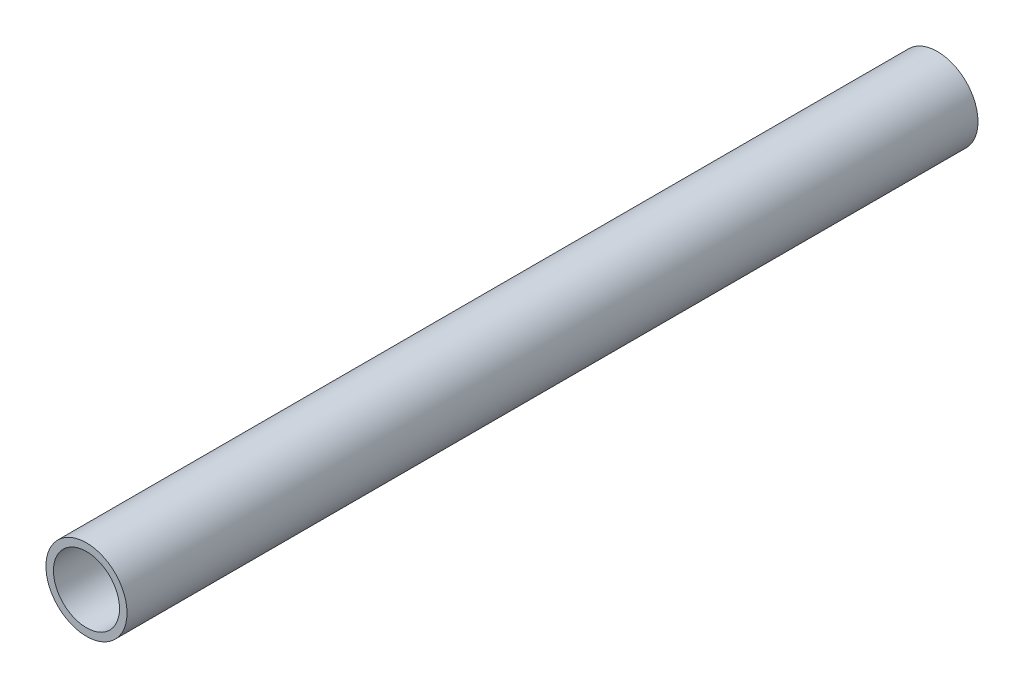
ISO-10303-21;
HEADER;
FILE_DESCRIPTION(('STEP AP214'),'2;1');
FILE_NAME('part.step','',(''),(''),'','','');
FILE_SCHEMA(('AUTOMOTIVE_DESIGN { 1 0 10303 214 1 1 1 1 }'));
ENDSEC;
DATA;
#1=APPLICATION_CONTEXT('core data for automotive mechanical design processes');
#2=APPLICATION_PROTOCOL_DEFINITION('international standard','automotive_design',2000,#1);
#3=PRODUCT_CONTEXT('',#1,'mechanical');
#4=PRODUCT('Part','Part','',(#3));
#5=PRODUCT_RELATED_PRODUCT_CATEGORY('part','',(#4));
#6=PRODUCT_DEFINITION_FORMATION('','',#4);
#7=PRODUCT_DEFINITION_CONTEXT('part definition',#1,'design');
#8=PRODUCT_DEFINITION('design','',#6,#7);
#9=PRODUCT_DEFINITION_SHAPE('','',#8);
#10=(LENGTH_UNIT() NAMED_UNIT(*) SI_UNIT(.MILLI.,.METRE.));
#11=(NAMED_UNIT(*) PLANE_ANGLE_UNIT() SI_UNIT($,.RADIAN.));
#12=(NAMED_UNIT(*) SI_UNIT($,.STERADIAN.) SOLID_ANGLE_UNIT());
#13=UNCERTAINTY_MEASURE_WITH_UNIT(LENGTH_MEASURE(1.E-05),#10,'distance_accuracy_value','');
#14=(GEOMETRIC_REPRESENTATION_CONTEXT(3) GLOBAL_UNCERTAINTY_ASSIGNED_CONTEXT((#13)) GLOBAL_UNIT_ASSIGNED_CONTEXT((#10,
#11,#12)) REPRESENTATION_CONTEXT('',''));
#15=CARTESIAN_POINT('',(0.,0.,0.));
#16=DIRECTION('',(0.,0.,1.));
#17=DIRECTION('',(1.,0.,0.));
#18=AXIS2_PLACEMENT_3D('',#15,#16,#17);
#19=CARTESIAN_POINT('',(0.,0.,85.));
#20=DIRECTION('',(0.,0.,1.));
#21=DIRECTION('',(1.,0.,0.));
#22=AXIS2_PLACEMENT_3D('',#19,#20,#21);
#23=PLANE('',#22);
#24=CARTESIAN_POINT('',(0.,0.,85.));
#25=DIRECTION('',(0.,0.,1.));
#26=DIRECTION('',(1.,0.,0.));
#27=AXIS2_PLACEMENT_3D('',#24,#25,#26);
#28=CIRCLE('',#27,8.1);
#29=CARTESIAN_POINT('',(8.1,0.,85.));
#30=VERTEX_POINT('',#29);
#31=EDGE_CURVE('E10',#30,#30,#28,.T.);
#32=ORIENTED_EDGE('',*,*,#31,.T.);
#33=EDGE_LOOP('',(#32));
#34=FACE_BOUND('',#33,.T.);
#35=CARTESIAN_POINT('',(0.,0.,85.));
#36=DIRECTION('',(0.,0.,1.));
#37=DIRECTION('',(1.,0.,0.));
#38=AXIS2_PLACEMENT_3D('',#35,#36,#37);
#39=CIRCLE('',#38,6.6);
#40=CARTESIAN_POINT('',(6.6,0.,85.));
#41=VERTEX_POINT('',#40);
#42=EDGE_CURVE('E50',#41,#41,#39,.T.);
#43=ORIENTED_EDGE('',*,*,#42,.F.);
#44=EDGE_LOOP('',(#43));
#45=FACE_BOUND('',#44,.T.);
#46=ADVANCED_FACE('F37',(#34,#45),#23,.T.);
#47=CARTESIAN_POINT('',(0.,0.,-85.));
#48=DIRECTION('',(0.,0.,1.));
#49=DIRECTION('',(1.,0.,0.));
#50=AXIS2_PLACEMENT_3D('',#47,#48,#49);
#51=PLANE('',#50);
#52=CARTESIAN_POINT('',(0.,0.,-85.));
#53=DIRECTION('',(0.,0.,1.));
#54=DIRECTION('',(1.,0.,0.));
#55=AXIS2_PLACEMENT_3D('',#52,#53,#54);
#56=CIRCLE('',#55,8.1);
#57=CARTESIAN_POINT('',(8.1,0.,-85.));
#58=VERTEX_POINT('',#57);
#59=EDGE_CURVE('E41',#58,#58,#56,.T.);
#60=ORIENTED_EDGE('',*,*,#59,.F.);
#61=EDGE_LOOP('',(#60));
#62=FACE_BOUND('',#61,.T.);
#63=CARTESIAN_POINT('',(0.,0.,-85.));
#64=DIRECTION('',(0.,0.,1.));
#65=DIRECTION('',(1.,0.,0.));
#66=AXIS2_PLACEMENT_3D('',#63,#64,#65);
#67=CIRCLE('',#66,6.6);
#68=CARTESIAN_POINT('',(6.6,0.,-85.));
#69=VERTEX_POINT('',#68);
#70=EDGE_CURVE('E52',#69,#69,#67,.T.);
#71=ORIENTED_EDGE('',*,*,#70,.T.);
#72=EDGE_LOOP('',(#71));
#73=FACE_BOUND('',#72,.T.);
#74=ADVANCED_FACE('F64',(#62,#73),#51,.F.);
#75=CARTESIAN_POINT('',(0.,0.,85.));
#76=DIRECTION('',(0.,0.,-1.));
#77=DIRECTION('',(-1.,0.,0.));
#78=AXIS2_PLACEMENT_3D('',#75,#76,#77);
#79=CYLINDRICAL_SURFACE('',#78,8.1);
#80=ORIENTED_EDGE('',*,*,#31,.F.);
#81=EDGE_LOOP('',(#80));
#82=FACE_BOUND('',#81,.T.);
#83=ORIENTED_EDGE('',*,*,#59,.T.);
#84=EDGE_LOOP('',(#83));
#85=FACE_BOUND('',#84,.T.);
#86=ADVANCED_FACE('F39',(#82,#85),#79,.T.);
#87=CARTESIAN_POINT('',(0.,0.,85.));
#88=DIRECTION('',(0.,0.,-1.));
#89=DIRECTION('',(-1.,0.,0.));
#90=AXIS2_PLACEMENT_3D('',#87,#88,#89);
#91=CYLINDRICAL_SURFACE('',#90,6.6);
#92=ORIENTED_EDGE('',*,*,#42,.T.);
#93=EDGE_LOOP('',(#92));
#94=FACE_BOUND('',#93,.T.);
#95=ORIENTED_EDGE('',*,*,#70,.F.);
#96=EDGE_LOOP('',(#95));
#97=FACE_BOUND('',#96,.T.);
#98=ADVANCED_FACE('F60',(#94,#97),#91,.F.);
#99=CLOSED_SHELL('',(#46,#74,#86,#98));
#100=MANIFOLD_SOLID_BREP('B2',#99);
#101=ADVANCED_BREP_SHAPE_REPRESENTATION('',(#18,#100),#14);
#102=SHAPE_DEFINITION_REPRESENTATION(#9,#101);
ENDSEC;
END-ISO-10303-21;
